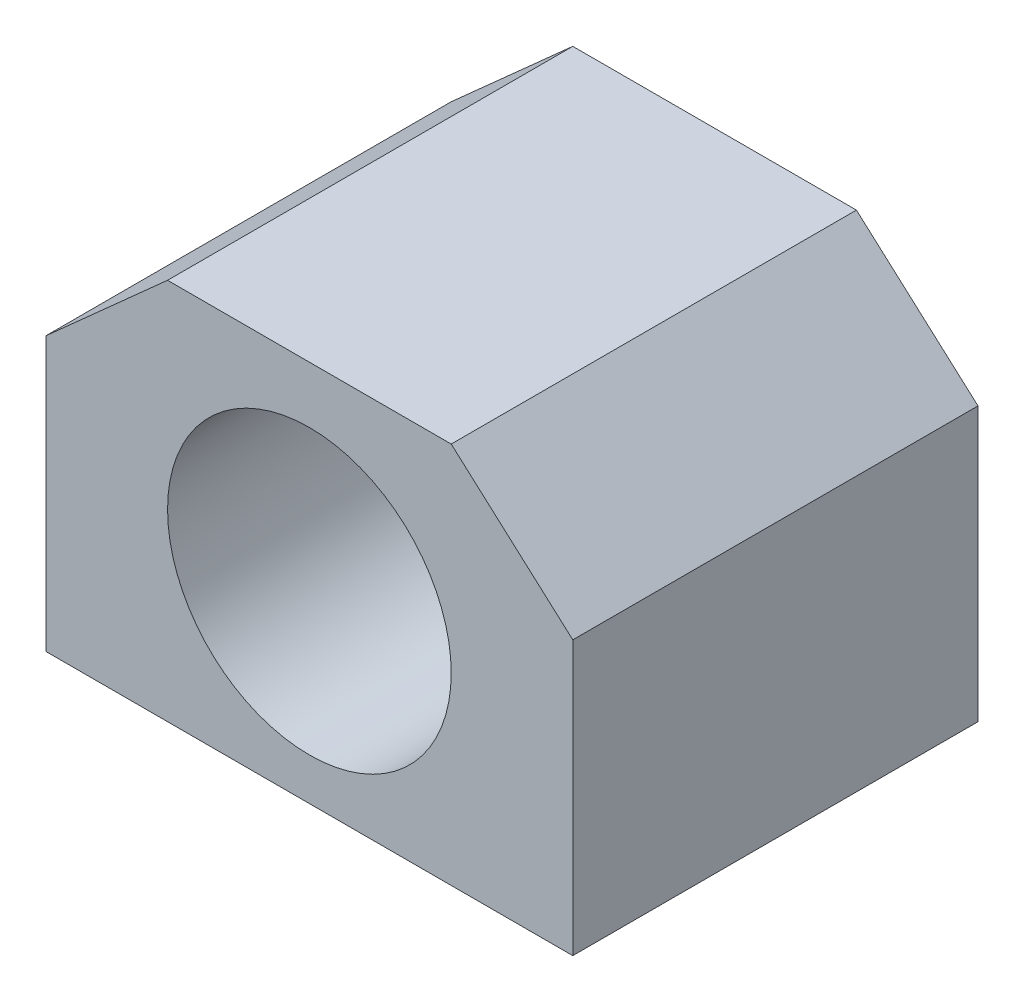
ISO-10303-21;
HEADER;
FILE_DESCRIPTION(('STEP AP214'),'2;1');
FILE_NAME('part.step','',(''),(''),'','','');
FILE_SCHEMA(('AUTOMOTIVE_DESIGN { 1 0 10303 214 1 1 1 1 }'));
ENDSEC;
DATA;
#1=APPLICATION_CONTEXT('core data for automotive mechanical design processes');
#2=APPLICATION_PROTOCOL_DEFINITION('international standard','automotive_design',2000,#1);
#3=PRODUCT_CONTEXT('',#1,'mechanical');
#4=PRODUCT('Part','Part','',(#3));
#5=PRODUCT_RELATED_PRODUCT_CATEGORY('part','',(#4));
#6=PRODUCT_DEFINITION_FORMATION('','',#4);
#7=PRODUCT_DEFINITION_CONTEXT('part definition',#1,'design');
#8=PRODUCT_DEFINITION('design','',#6,#7);
#9=PRODUCT_DEFINITION_SHAPE('','',#8);
#10=(LENGTH_UNIT() NAMED_UNIT(*) SI_UNIT(.MILLI.,.METRE.));
#11=(NAMED_UNIT(*) PLANE_ANGLE_UNIT() SI_UNIT($,.RADIAN.));
#12=(NAMED_UNIT(*) SI_UNIT($,.STERADIAN.) SOLID_ANGLE_UNIT());
#13=UNCERTAINTY_MEASURE_WITH_UNIT(LENGTH_MEASURE(1.E-05),#10,'distance_accuracy_value','');
#14=(GEOMETRIC_REPRESENTATION_CONTEXT(3) GLOBAL_UNCERTAINTY_ASSIGNED_CONTEXT((#13)) GLOBAL_UNIT_ASSIGNED_CONTEXT((#10,
#11,#12)) REPRESENTATION_CONTEXT('',''));
#15=CARTESIAN_POINT('',(0.,0.,0.));
#16=DIRECTION('',(0.,0.,1.));
#17=DIRECTION('',(1.,0.,0.));
#18=AXIS2_PLACEMENT_3D('',#15,#16,#17);
#19=CARTESIAN_POINT('',(0.,0.,40.));
#20=DIRECTION('',(0.,0.,1.));
#21=DIRECTION('',(1.,0.,0.));
#22=AXIS2_PLACEMENT_3D('',#19,#20,#21);
#23=PLANE('',#22);
#24=DIRECTION('',(0.,-1.,0.));
#25=VECTOR('',#24,1.);
#26=CARTESIAN_POINT('',(0.,27.,40.));
#27=LINE('',#26,#25);
#28=CARTESIAN_POINT('',(0.,27.,40.));
#29=VERTEX_POINT('',#28);
#30=CARTESIAN_POINT('',(0.,0.,40.));
#31=VERTEX_POINT('',#30);
#32=EDGE_CURVE('E146',#29,#31,#27,.T.);
#33=ORIENTED_EDGE('',*,*,#32,.T.);
#34=DIRECTION('',(1.,0.,0.));
#35=VECTOR('',#34,1.);
#36=CARTESIAN_POINT('',(0.,0.,40.));
#37=LINE('',#36,#35);
#38=CARTESIAN_POINT('',(52.,0.,40.));
#39=VERTEX_POINT('',#38);
#40=EDGE_CURVE('E94',#31,#39,#37,.T.);
#41=ORIENTED_EDGE('',*,*,#40,.T.);
#42=DIRECTION('',(0.,1.,0.));
#43=VECTOR('',#42,1.);
#44=CARTESIAN_POINT('',(52.,0.,40.));
#45=LINE('',#44,#43);
#46=CARTESIAN_POINT('',(52.,27.,40.));
#47=VERTEX_POINT('',#46);
#48=EDGE_CURVE('E107',#39,#47,#45,.T.);
#49=ORIENTED_EDGE('',*,*,#48,.T.);
#50=DIRECTION('',(-0.745212992473554,0.66682651105712,0.));
#51=VECTOR('',#50,1.);
#52=CARTESIAN_POINT('',(40.,37.7377598263887,40.));
#53=LINE('',#52,#51);
#54=CARTESIAN_POINT('',(40.,37.7377598263887,40.));
#55=VERTEX_POINT('',#54);
#56=EDGE_CURVE('E101',#47,#55,#53,.T.);
#57=ORIENTED_EDGE('',*,*,#56,.T.);
#58=DIRECTION('',(-1.,0.,0.));
#59=VECTOR('',#58,1.);
#60=CARTESIAN_POINT('',(12.,37.7377598263887,40.));
#61=LINE('',#60,#59);
#62=CARTESIAN_POINT('',(12.,37.7377598263887,40.));
#63=VERTEX_POINT('',#62);
#64=EDGE_CURVE('E105',#55,#63,#61,.T.);
#65=ORIENTED_EDGE('',*,*,#64,.T.);
#66=DIRECTION('',(-0.745212992473554,-0.66682651105712,0.));
#67=VECTOR('',#66,1.);
#68=CARTESIAN_POINT('',(0.,27.,40.));
#69=LINE('',#68,#67);
#70=EDGE_CURVE('E57',#63,#29,#69,.T.);
#71=ORIENTED_EDGE('',*,*,#70,.T.);
#72=EDGE_LOOP('',(#33,#41,#49,#57,#65,#71));
#73=FACE_BOUND('',#72,.T.);
#74=CARTESIAN_POINT('',(26.,18.1577598263887,40.));
#75=DIRECTION('',(0.,0.,1.));
#76=DIRECTION('',(1.,0.,0.));
#77=AXIS2_PLACEMENT_3D('',#74,#75,#76);
#78=CIRCLE('',#77,14.);
#79=CARTESIAN_POINT('',(40.,18.1577598263887,40.));
#80=VERTEX_POINT('',#79);
#81=EDGE_CURVE('E134',#80,#80,#78,.T.);
#82=ORIENTED_EDGE('',*,*,#81,.F.);
#83=EDGE_LOOP('',(#82));
#84=FACE_BOUND('',#83,.T.);
#85=ADVANCED_FACE('F39',(#73,#84),#23,.T.);
#86=CARTESIAN_POINT('',(0.,0.,0.));
#87=DIRECTION('',(0.,0.,1.));
#88=DIRECTION('',(1.,0.,0.));
#89=AXIS2_PLACEMENT_3D('',#86,#87,#88);
#90=PLANE('',#89);
#91=DIRECTION('',(0.,-1.,0.));
#92=VECTOR('',#91,1.);
#93=CARTESIAN_POINT('',(0.,27.,0.));
#94=LINE('',#93,#92);
#95=CARTESIAN_POINT('',(0.,27.,0.));
#96=VERTEX_POINT('',#95);
#97=CARTESIAN_POINT('',(0.,0.,0.));
#98=VERTEX_POINT('',#97);
#99=EDGE_CURVE('E129',#96,#98,#94,.T.);
#100=ORIENTED_EDGE('',*,*,#99,.F.);
#101=DIRECTION('',(-0.745212992473554,-0.66682651105712,0.));
#102=VECTOR('',#101,1.);
#103=CARTESIAN_POINT('',(0.,27.,0.));
#104=LINE('',#103,#102);
#105=CARTESIAN_POINT('',(12.,37.7377598263887,0.));
#106=VERTEX_POINT('',#105);
#107=EDGE_CURVE('E86',#106,#96,#104,.T.);
#108=ORIENTED_EDGE('',*,*,#107,.F.);
#109=DIRECTION('',(-1.,0.,0.));
#110=VECTOR('',#109,1.);
#111=CARTESIAN_POINT('',(12.,37.7377598263887,0.));
#112=LINE('',#111,#110);
#113=CARTESIAN_POINT('',(40.,37.7377598263887,0.));
#114=VERTEX_POINT('',#113);
#115=EDGE_CURVE('E80',#114,#106,#112,.T.);
#116=ORIENTED_EDGE('',*,*,#115,.F.);
#117=DIRECTION('',(-0.745212992473554,0.66682651105712,0.));
#118=VECTOR('',#117,1.);
#119=CARTESIAN_POINT('',(40.,37.7377598263887,0.));
#120=LINE('',#119,#118);
#121=CARTESIAN_POINT('',(52.,27.,0.));
#122=VERTEX_POINT('',#121);
#123=EDGE_CURVE('E116',#122,#114,#120,.T.);
#124=ORIENTED_EDGE('',*,*,#123,.F.);
#125=DIRECTION('',(0.,1.,0.));
#126=VECTOR('',#125,1.);
#127=CARTESIAN_POINT('',(52.,0.,0.));
#128=LINE('',#127,#126);
#129=CARTESIAN_POINT('',(52.,0.,0.));
#130=VERTEX_POINT('',#129);
#131=EDGE_CURVE('E137',#130,#122,#128,.T.);
#132=ORIENTED_EDGE('',*,*,#131,.F.);
#133=DIRECTION('',(1.,0.,0.));
#134=VECTOR('',#133,1.);
#135=CARTESIAN_POINT('',(0.,0.,0.));
#136=LINE('',#135,#134);
#137=EDGE_CURVE('E133',#98,#130,#136,.T.);
#138=ORIENTED_EDGE('',*,*,#137,.F.);
#139=EDGE_LOOP('',(#100,#108,#116,#124,#132,#138));
#140=FACE_BOUND('',#139,.T.);
#141=CARTESIAN_POINT('',(26.,18.1577598263887,0.));
#142=DIRECTION('',(0.,0.,1.));
#143=DIRECTION('',(1.,0.,0.));
#144=AXIS2_PLACEMENT_3D('',#141,#142,#143);
#145=CIRCLE('',#144,14.);
#146=CARTESIAN_POINT('',(40.,18.1577598263887,0.));
#147=VERTEX_POINT('',#146);
#148=EDGE_CURVE('E246',#147,#147,#145,.T.);
#149=ORIENTED_EDGE('',*,*,#148,.T.);
#150=EDGE_LOOP('',(#149));
#151=FACE_BOUND('',#150,.T.);
#152=ADVANCED_FACE('F159',(#140,#151),#90,.F.);
#153=CARTESIAN_POINT('',(0.,27.,40.));
#154=DIRECTION('',(1.,0.,0.));
#155=DIRECTION('',(0.,1.,0.));
#156=AXIS2_PLACEMENT_3D('',#153,#154,#155);
#157=PLANE('',#156);
#158=ORIENTED_EDGE('',*,*,#99,.T.);
#159=DIRECTION('',(0.,0.,-1.));
#160=VECTOR('',#159,1.);
#161=CARTESIAN_POINT('',(0.,0.,40.));
#162=LINE('',#161,#160);
#163=EDGE_CURVE('E11',#31,#98,#162,.T.);
#164=ORIENTED_EDGE('',*,*,#163,.F.);
#165=ORIENTED_EDGE('',*,*,#32,.F.);
#166=DIRECTION('',(0.,0.,-1.));
#167=VECTOR('',#166,1.);
#168=CARTESIAN_POINT('',(0.,27.,40.));
#169=LINE('',#168,#167);
#170=EDGE_CURVE('E125',#29,#96,#169,.T.);
#171=ORIENTED_EDGE('',*,*,#170,.T.);
#172=EDGE_LOOP('',(#158,#164,#165,#171));
#173=FACE_BOUND('',#172,.T.);
#174=ADVANCED_FACE('F41',(#173),#157,.F.);
#175=CARTESIAN_POINT('',(0.,0.,40.));
#176=DIRECTION('',(0.,1.,0.));
#177=DIRECTION('',(0.,0.,1.));
#178=AXIS2_PLACEMENT_3D('',#175,#176,#177);
#179=PLANE('',#178);
#180=CARTESIAN_POINT('',(46.,0.,34.));
#181=DIRECTION('',(0.,-1.,0.));
#182=DIRECTION('',(0.,0.,-1.));
#183=AXIS2_PLACEMENT_3D('',#180,#181,#182);
#184=CIRCLE('',#183,2.);
#185=CARTESIAN_POINT('',(46.,0.,32.));
#186=VERTEX_POINT('',#185);
#187=EDGE_CURVE('E235',#186,#186,#184,.T.);
#188=ORIENTED_EDGE('',*,*,#187,.F.);
#189=EDGE_LOOP('',(#188));
#190=FACE_BOUND('',#189,.T.);
#191=CARTESIAN_POINT('',(6.,0.,6.));
#192=DIRECTION('',(0.,-1.,0.));
#193=DIRECTION('',(0.,0.,-1.));
#194=AXIS2_PLACEMENT_3D('',#191,#192,#193);
#195=CIRCLE('',#194,2.);
#196=CARTESIAN_POINT('',(6.,0.,4.));
#197=VERTEX_POINT('',#196);
#198=EDGE_CURVE('E219',#197,#197,#195,.T.);
#199=ORIENTED_EDGE('',*,*,#198,.F.);
#200=EDGE_LOOP('',(#199));
#201=FACE_BOUND('',#200,.T.);
#202=CARTESIAN_POINT('',(46.,0.,6.));
#203=DIRECTION('',(0.,-1.,0.));
#204=DIRECTION('',(0.,0.,-1.));
#205=AXIS2_PLACEMENT_3D('',#202,#203,#204);
#206=CIRCLE('',#205,2.);
#207=CARTESIAN_POINT('',(46.,0.,3.99999999999999));
#208=VERTEX_POINT('',#207);
#209=EDGE_CURVE('E220',#208,#208,#206,.T.);
#210=ORIENTED_EDGE('',*,*,#209,.F.);
#211=EDGE_LOOP('',(#210));
#212=FACE_BOUND('',#211,.T.);
#213=CARTESIAN_POINT('',(6.,0.,34.));
#214=DIRECTION('',(0.,-1.,0.));
#215=DIRECTION('',(0.,0.,-1.));
#216=AXIS2_PLACEMENT_3D('',#213,#214,#215);
#217=CIRCLE('',#216,2.);
#218=CARTESIAN_POINT('',(6.,0.,32.));
#219=VERTEX_POINT('',#218);
#220=EDGE_CURVE('E234',#219,#219,#217,.T.);
#221=ORIENTED_EDGE('',*,*,#220,.F.);
#222=EDGE_LOOP('',(#221));
#223=FACE_BOUND('',#222,.T.);
#224=ORIENTED_EDGE('',*,*,#137,.T.);
#225=DIRECTION('',(0.,0.,-1.));
#226=VECTOR('',#225,1.);
#227=CARTESIAN_POINT('',(52.,0.,40.));
#228=LINE('',#227,#226);
#229=EDGE_CURVE('E49',#39,#130,#228,.T.);
#230=ORIENTED_EDGE('',*,*,#229,.F.);
#231=ORIENTED_EDGE('',*,*,#40,.F.);
#232=ORIENTED_EDGE('',*,*,#163,.T.);
#233=EDGE_LOOP('',(#224,#230,#231,#232));
#234=FACE_BOUND('',#233,.T.);
#235=ADVANCED_FACE('F266',(#190,#201,#212,#223,#234),#179,.F.);
#236=CARTESIAN_POINT('',(52.,0.,40.));
#237=DIRECTION('',(-1.,0.,0.));
#238=DIRECTION('',(0.,0.,1.));
#239=AXIS2_PLACEMENT_3D('',#236,#237,#238);
#240=PLANE('',#239);
#241=ORIENTED_EDGE('',*,*,#131,.T.);
#242=DIRECTION('',(0.,0.,-1.));
#243=VECTOR('',#242,1.);
#244=CARTESIAN_POINT('',(52.,27.,40.));
#245=LINE('',#244,#243);
#246=EDGE_CURVE('E118',#47,#122,#245,.T.);
#247=ORIENTED_EDGE('',*,*,#246,.F.);
#248=ORIENTED_EDGE('',*,*,#48,.F.);
#249=ORIENTED_EDGE('',*,*,#229,.T.);
#250=EDGE_LOOP('',(#241,#247,#248,#249));
#251=FACE_BOUND('',#250,.T.);
#252=ADVANCED_FACE('F156',(#251),#240,.F.);
#253=CARTESIAN_POINT('',(40.,37.7377598263887,40.));
#254=DIRECTION('',(-0.66682651105712,-0.745212992473554,0.));
#255=DIRECTION('',(0.745212992473554,-0.66682651105712,0.));
#256=AXIS2_PLACEMENT_3D('',#253,#254,#255);
#257=PLANE('',#256);
#258=ORIENTED_EDGE('',*,*,#123,.T.);
#259=DIRECTION('',(0.,0.,-1.));
#260=VECTOR('',#259,1.);
#261=CARTESIAN_POINT('',(40.,37.7377598263887,40.));
#262=LINE('',#261,#260);
#263=EDGE_CURVE('E113',#55,#114,#262,.T.);
#264=ORIENTED_EDGE('',*,*,#263,.F.);
#265=ORIENTED_EDGE('',*,*,#56,.F.);
#266=ORIENTED_EDGE('',*,*,#246,.T.);
#267=EDGE_LOOP('',(#258,#264,#265,#266));
#268=FACE_BOUND('',#267,.T.);
#269=ADVANCED_FACE('F114',(#268),#257,.F.);
#270=CARTESIAN_POINT('',(12.,37.7377598263887,40.));
#271=DIRECTION('',(0.,-1.,0.));
#272=DIRECTION('',(0.,0.,-1.));
#273=AXIS2_PLACEMENT_3D('',#270,#271,#272);
#274=PLANE('',#273);
#275=ORIENTED_EDGE('',*,*,#115,.T.);
#276=DIRECTION('',(0.,0.,-1.));
#277=VECTOR('',#276,1.);
#278=CARTESIAN_POINT('',(12.,37.7377598263887,40.));
#279=LINE('',#278,#277);
#280=EDGE_CURVE('E119',#63,#106,#279,.T.);
#281=ORIENTED_EDGE('',*,*,#280,.F.);
#282=ORIENTED_EDGE('',*,*,#64,.F.);
#283=ORIENTED_EDGE('',*,*,#263,.T.);
#284=EDGE_LOOP('',(#275,#281,#282,#283));
#285=FACE_BOUND('',#284,.T.);
#286=ADVANCED_FACE('F121',(#285),#274,.F.);
#287=CARTESIAN_POINT('',(0.,27.,40.));
#288=DIRECTION('',(0.66682651105712,-0.745212992473554,0.));
#289=DIRECTION('',(0.745212992473554,0.66682651105712,0.));
#290=AXIS2_PLACEMENT_3D('',#287,#288,#289);
#291=PLANE('',#290);
#292=ORIENTED_EDGE('',*,*,#107,.T.);
#293=ORIENTED_EDGE('',*,*,#170,.F.);
#294=ORIENTED_EDGE('',*,*,#70,.F.);
#295=ORIENTED_EDGE('',*,*,#280,.T.);
#296=EDGE_LOOP('',(#292,#293,#294,#295));
#297=FACE_BOUND('',#296,.T.);
#298=ADVANCED_FACE('F164',(#297),#291,.F.);
#299=CARTESIAN_POINT('',(26.,18.1577598263887,40.));
#300=DIRECTION('',(0.,0.,-1.));
#301=DIRECTION('',(-1.,0.,0.));
#302=AXIS2_PLACEMENT_3D('',#299,#300,#301);
#303=CYLINDRICAL_SURFACE('',#302,14.);
#304=ORIENTED_EDGE('',*,*,#81,.T.);
#305=EDGE_LOOP('',(#304));
#306=FACE_BOUND('',#305,.T.);
#307=ORIENTED_EDGE('',*,*,#148,.F.);
#308=EDGE_LOOP('',(#307));
#309=FACE_BOUND('',#308,.T.);
#310=ADVANCED_FACE('F166',(#306,#309),#303,.F.);
#311=CARTESIAN_POINT('',(6.,10.,34.));
#312=DIRECTION('',(0.,-1.,0.));
#313=DIRECTION('',(0.,0.,-1.));
#314=AXIS2_PLACEMENT_3D('',#311,#312,#313);
#315=CYLINDRICAL_SURFACE('',#314,2.);
#316=CARTESIAN_POINT('',(6.,10.,34.));
#317=DIRECTION('',(0.,-1.,0.));
#318=DIRECTION('',(0.,0.,-1.));
#319=AXIS2_PLACEMENT_3D('',#316,#317,#318);
#320=CIRCLE('',#319,2.);
#321=CARTESIAN_POINT('',(6.,10.,32.));
#322=VERTEX_POINT('',#321);
#323=EDGE_CURVE('E242',#322,#322,#320,.T.);
#324=ORIENTED_EDGE('',*,*,#323,.F.);
#325=EDGE_LOOP('',(#324));
#326=FACE_BOUND('',#325,.T.);
#327=ORIENTED_EDGE('',*,*,#220,.T.);
#328=EDGE_LOOP('',(#327));
#329=FACE_BOUND('',#328,.T.);
#330=ADVANCED_FACE('F172',(#326,#329),#315,.F.);
#331=CARTESIAN_POINT('',(6.,10.,34.));
#332=DIRECTION('',(0.,-1.,0.));
#333=DIRECTION('',(0.,0.,-1.));
#334=AXIS2_PLACEMENT_3D('',#331,#332,#333);
#335=PLANE('',#334);
#336=ORIENTED_EDGE('',*,*,#323,.T.);
#337=EDGE_LOOP('',(#336));
#338=FACE_BOUND('',#337,.T.);
#339=ADVANCED_FACE('F185',(#338),#335,.T.);
#340=CARTESIAN_POINT('',(46.,10.,6.));
#341=DIRECTION('',(0.,-1.,0.));
#342=DIRECTION('',(0.,0.,-1.));
#343=AXIS2_PLACEMENT_3D('',#340,#341,#342);
#344=CYLINDRICAL_SURFACE('',#343,2.);
#345=CARTESIAN_POINT('',(46.,10.,6.));
#346=DIRECTION('',(0.,-1.,0.));
#347=DIRECTION('',(0.,0.,-1.));
#348=AXIS2_PLACEMENT_3D('',#345,#346,#347);
#349=CIRCLE('',#348,2.);
#350=CARTESIAN_POINT('',(46.,10.,3.99999999999999));
#351=VERTEX_POINT('',#350);
#352=EDGE_CURVE('E217',#351,#351,#349,.T.);
#353=ORIENTED_EDGE('',*,*,#352,.F.);
#354=EDGE_LOOP('',(#353));
#355=FACE_BOUND('',#354,.T.);
#356=ORIENTED_EDGE('',*,*,#209,.T.);
#357=EDGE_LOOP('',(#356));
#358=FACE_BOUND('',#357,.T.);
#359=ADVANCED_FACE('F189',(#355,#358),#344,.F.);
#360=CARTESIAN_POINT('',(46.,10.,6.));
#361=DIRECTION('',(0.,-1.,0.));
#362=DIRECTION('',(0.,0.,-1.));
#363=AXIS2_PLACEMENT_3D('',#360,#361,#362);
#364=PLANE('',#363);
#365=ORIENTED_EDGE('',*,*,#352,.T.);
#366=EDGE_LOOP('',(#365));
#367=FACE_BOUND('',#366,.T.);
#368=ADVANCED_FACE('F195',(#367),#364,.T.);
#369=CARTESIAN_POINT('',(6.,10.,6.));
#370=DIRECTION('',(0.,-1.,0.));
#371=DIRECTION('',(0.,0.,-1.));
#372=AXIS2_PLACEMENT_3D('',#369,#370,#371);
#373=CYLINDRICAL_SURFACE('',#372,2.);
#374=CARTESIAN_POINT('',(6.,10.,6.));
#375=DIRECTION('',(0.,-1.,0.));
#376=DIRECTION('',(0.,0.,-1.));
#377=AXIS2_PLACEMENT_3D('',#374,#375,#376);
#378=CIRCLE('',#377,2.);
#379=CARTESIAN_POINT('',(6.,10.,4.));
#380=VERTEX_POINT('',#379);
#381=EDGE_CURVE('E225',#380,#380,#378,.T.);
#382=ORIENTED_EDGE('',*,*,#381,.F.);
#383=EDGE_LOOP('',(#382));
#384=FACE_BOUND('',#383,.T.);
#385=ORIENTED_EDGE('',*,*,#198,.T.);
#386=EDGE_LOOP('',(#385));
#387=FACE_BOUND('',#386,.T.);
#388=ADVANCED_FACE('F191',(#384,#387),#373,.F.);
#389=CARTESIAN_POINT('',(6.,10.,6.));
#390=DIRECTION('',(0.,-1.,0.));
#391=DIRECTION('',(0.,0.,-1.));
#392=AXIS2_PLACEMENT_3D('',#389,#390,#391);
#393=PLANE('',#392);
#394=ORIENTED_EDGE('',*,*,#381,.T.);
#395=EDGE_LOOP('',(#394));
#396=FACE_BOUND('',#395,.T.);
#397=ADVANCED_FACE('F194',(#396),#393,.T.);
#398=CARTESIAN_POINT('',(46.,10.,34.));
#399=DIRECTION('',(0.,-1.,0.));
#400=DIRECTION('',(0.,0.,-1.));
#401=AXIS2_PLACEMENT_3D('',#398,#399,#400);
#402=CYLINDRICAL_SURFACE('',#401,2.);
#403=CARTESIAN_POINT('',(46.,10.,34.));
#404=DIRECTION('',(0.,-1.,0.));
#405=DIRECTION('',(0.,0.,-1.));
#406=AXIS2_PLACEMENT_3D('',#403,#404,#405);
#407=CIRCLE('',#406,2.);
#408=CARTESIAN_POINT('',(46.,10.,32.));
#409=VERTEX_POINT('',#408);
#410=EDGE_CURVE('E230',#409,#409,#407,.T.);
#411=ORIENTED_EDGE('',*,*,#410,.F.);
#412=EDGE_LOOP('',(#411));
#413=FACE_BOUND('',#412,.T.);
#414=ORIENTED_EDGE('',*,*,#187,.T.);
#415=EDGE_LOOP('',(#414));
#416=FACE_BOUND('',#415,.T.);
#417=ADVANCED_FACE('F199',(#413,#416),#402,.F.);
#418=CARTESIAN_POINT('',(46.,10.,34.));
#419=DIRECTION('',(0.,-1.,0.));
#420=DIRECTION('',(0.,0.,-1.));
#421=AXIS2_PLACEMENT_3D('',#418,#419,#420);
#422=PLANE('',#421);
#423=ORIENTED_EDGE('',*,*,#410,.T.);
#424=EDGE_LOOP('',(#423));
#425=FACE_BOUND('',#424,.T.);
#426=ADVANCED_FACE('F203',(#425),#422,.T.);
#427=CLOSED_SHELL('',(#85,#152,#174,#235,#252,#269,#286,#298,#310,#330,#339,#359,#368,#388,#397,
#417,#426));
#428=MANIFOLD_SOLID_BREP('B2',#427);
#429=ADVANCED_BREP_SHAPE_REPRESENTATION('',(#18,#428),#14);
#430=SHAPE_DEFINITION_REPRESENTATION(#9,#429);
ENDSEC;
END-ISO-10303-21;
